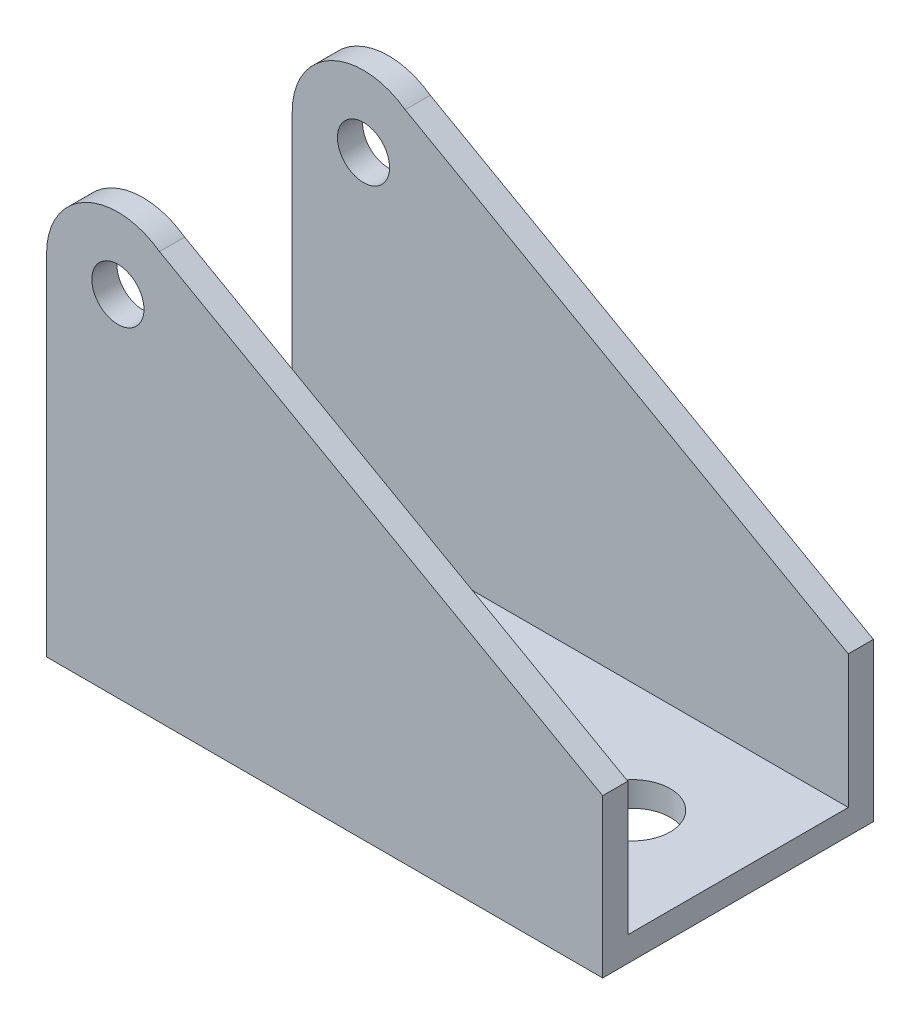
ISO-10303-21;
HEADER;
FILE_DESCRIPTION(('STEP AP214'),'2;1');
FILE_NAME('part.step','',(''),(''),'','','');
FILE_SCHEMA(('AUTOMOTIVE_DESIGN { 1 0 10303 214 1 1 1 1 }'));
ENDSEC;
DATA;
#1=APPLICATION_CONTEXT('core data for automotive mechanical design processes');
#2=APPLICATION_PROTOCOL_DEFINITION('international standard','automotive_design',2000,#1);
#3=PRODUCT_CONTEXT('',#1,'mechanical');
#4=PRODUCT('Part','Part','',(#3));
#5=PRODUCT_RELATED_PRODUCT_CATEGORY('part','',(#4));
#6=PRODUCT_DEFINITION_FORMATION('','',#4);
#7=PRODUCT_DEFINITION_CONTEXT('part definition',#1,'design');
#8=PRODUCT_DEFINITION('design','',#6,#7);
#9=PRODUCT_DEFINITION_SHAPE('','',#8);
#10=(LENGTH_UNIT() NAMED_UNIT(*) SI_UNIT(.MILLI.,.METRE.));
#11=(NAMED_UNIT(*) PLANE_ANGLE_UNIT() SI_UNIT($,.RADIAN.));
#12=(NAMED_UNIT(*) SI_UNIT($,.STERADIAN.) SOLID_ANGLE_UNIT());
#13=UNCERTAINTY_MEASURE_WITH_UNIT(LENGTH_MEASURE(1.E-05),#10,'distance_accuracy_value','');
#14=(GEOMETRIC_REPRESENTATION_CONTEXT(3) GLOBAL_UNCERTAINTY_ASSIGNED_CONTEXT((#13)) GLOBAL_UNIT_ASSIGNED_CONTEXT((#10,
#11,#12)) REPRESENTATION_CONTEXT('',''));
#15=CARTESIAN_POINT('',(0.,0.,0.));
#16=DIRECTION('',(0.,0.,1.));
#17=DIRECTION('',(1.,0.,0.));
#18=AXIS2_PLACEMENT_3D('',#15,#16,#17);
#19=CARTESIAN_POINT('',(-34.5093541589494,0.,28.26));
#20=DIRECTION('',(1.,0.,0.));
#21=DIRECTION('',(0.,0.,-1.));
#22=AXIS2_PLACEMENT_3D('',#19,#20,#21);
#23=PLANE('',#22);
#24=DIRECTION('',(0.,1.,0.));
#25=VECTOR('',#24,1.);
#26=CARTESIAN_POINT('',(-34.5093541589494,-45.70762571926,18.22));
#27=LINE('',#26,#25);
#28=CARTESIAN_POINT('',(-34.5093541589494,-38.3049212208948,18.22));
#29=VERTEX_POINT('',#28);
#30=CARTESIAN_POINT('',(-34.5093541589494,-35.70762571926,18.22));
#31=VERTEX_POINT('',#30);
#32=EDGE_CURVE('E169',#29,#31,#27,.T.);
#33=ORIENTED_EDGE('',*,*,#32,.F.);
#34=DIRECTION('',(0.,0.,-1.));
#35=VECTOR('',#34,1.);
#36=CARTESIAN_POINT('',(-34.5093541589494,-38.3049212208948,28.26));
#37=LINE('',#36,#35);
#38=CARTESIAN_POINT('',(-34.5093541589494,-38.3049212208948,28.26));
#39=VERTEX_POINT('',#38);
#40=EDGE_CURVE('E253',#39,#29,#37,.T.);
#41=ORIENTED_EDGE('',*,*,#40,.F.);
#42=DIRECTION('',(0.,-1.,0.));
#43=VECTOR('',#42,1.);
#44=CARTESIAN_POINT('',(-34.5093541589494,0.,28.26));
#45=LINE('',#44,#43);
#46=CARTESIAN_POINT('',(-34.5093541589494,-1.80492122089481,28.26));
#47=VERTEX_POINT('',#46);
#48=EDGE_CURVE('E213',#47,#39,#45,.T.);
#49=ORIENTED_EDGE('',*,*,#48,.F.);
#50=DIRECTION('',(0.,0.,-1.));
#51=VECTOR('',#50,1.);
#52=CARTESIAN_POINT('',(-34.5093541589494,-1.80492122089481,28.26));
#53=LINE('',#52,#51);
#54=CARTESIAN_POINT('',(-34.5093541589494,-1.80492122089481,25.64));
#55=VERTEX_POINT('',#54);
#56=EDGE_CURVE('E50',#47,#55,#53,.T.);
#57=ORIENTED_EDGE('',*,*,#56,.T.);
#58=DIRECTION('',(0.,1.,0.));
#59=VECTOR('',#58,1.);
#60=CARTESIAN_POINT('',(-34.5093541589494,0.,25.64));
#61=LINE('',#60,#59);
#62=CARTESIAN_POINT('',(-34.5093541589494,-35.70762571926,25.64));
#63=VERTEX_POINT('',#62);
#64=EDGE_CURVE('E193',#63,#55,#61,.T.);
#65=ORIENTED_EDGE('',*,*,#64,.F.);
#66=DIRECTION('',(0.,0.,-1.));
#67=VECTOR('',#66,1.);
#68=CARTESIAN_POINT('',(-34.5093541589494,-35.70762571926,28.26));
#69=LINE('',#68,#67);
#70=EDGE_CURVE('E206',#63,#31,#69,.T.);
#71=ORIENTED_EDGE('',*,*,#70,.T.);
#72=EDGE_LOOP('',(#33,#41,#49,#57,#65,#71));
#73=FACE_BOUND('',#72,.T.);
#74=ADVANCED_FACE('F42',(#73),#23,.F.);
#75=CARTESIAN_POINT('',(0.,-38.3049212208948,28.26));
#76=DIRECTION('',(0.,1.,0.));
#77=DIRECTION('',(-1.,0.,0.));
#78=AXIS2_PLACEMENT_3D('',#75,#76,#77);
#79=PLANE('',#78);
#80=CARTESIAN_POINT('',(12.5306458410506,-38.3049212208948,14.13));
#81=DIRECTION('',(0.,1.,0.));
#82=DIRECTION('',(-1.,0.,0.));
#83=AXIS2_PLACEMENT_3D('',#80,#81,#82);
#84=CIRCLE('',#83,3.92);
#85=CARTESIAN_POINT('',(8.61064584105055,-38.3049212208948,14.13));
#86=VERTEX_POINT('',#85);
#87=EDGE_CURVE('E178',#86,#86,#84,.T.);
#88=ORIENTED_EDGE('',*,*,#87,.T.);
#89=EDGE_LOOP('',(#88));
#90=FACE_BOUND('',#89,.T.);
#91=DIRECTION('',(-1.,0.,0.));
#92=VECTOR('',#91,1.);
#93=CARTESIAN_POINT('',(0.,-38.3049212208948,18.22));
#94=LINE('',#93,#92);
#95=CARTESIAN_POINT('',(-26.3193541589494,-38.3049212208948,18.22));
#96=VERTEX_POINT('',#95);
#97=EDGE_CURVE('E176',#96,#29,#94,.T.);
#98=ORIENTED_EDGE('',*,*,#97,.F.);
#99=CARTESIAN_POINT('',(-26.3193541589494,-38.3049212208948,14.13));
#100=DIRECTION('',(0.,1.,0.));
#101=DIRECTION('',(-1.,0.,0.));
#102=AXIS2_PLACEMENT_3D('',#99,#100,#101);
#103=CIRCLE('',#102,4.09);
#104=CARTESIAN_POINT('',(-26.3193541589494,-38.3049212208948,10.04));
#105=VERTEX_POINT('',#104);
#106=EDGE_CURVE('E173',#96,#105,#103,.T.);
#107=ORIENTED_EDGE('',*,*,#106,.T.);
#108=DIRECTION('',(-1.,0.,0.));
#109=VECTOR('',#108,1.);
#110=CARTESIAN_POINT('',(0.,-38.3049212208948,10.04));
#111=LINE('',#110,#109);
#112=CARTESIAN_POINT('',(-34.5093541589494,-38.3049212208948,10.04));
#113=VERTEX_POINT('',#112);
#114=EDGE_CURVE('E150',#105,#113,#111,.T.);
#115=ORIENTED_EDGE('',*,*,#114,.T.);
#116=CARTESIAN_POINT('',(-34.5093541589494,-38.3049212208948,0.));
#117=VERTEX_POINT('',#116);
#118=EDGE_CURVE('E252',#113,#117,#37,.T.);
#119=ORIENTED_EDGE('',*,*,#118,.T.);
#120=DIRECTION('',(1.,0.,0.));
#121=VECTOR('',#120,1.);
#122=CARTESIAN_POINT('',(0.,-38.3049212208948,0.));
#123=LINE('',#122,#121);
#124=CARTESIAN_POINT('',(23.5306458410505,-38.3049212208948,0.));
#125=VERTEX_POINT('',#124);
#126=EDGE_CURVE('E232',#117,#125,#123,.T.);
#127=ORIENTED_EDGE('',*,*,#126,.T.);
#128=DIRECTION('',(0.,0.,-1.));
#129=VECTOR('',#128,1.);
#130=CARTESIAN_POINT('',(23.5306458410505,-38.3049212208948,28.26));
#131=LINE('',#130,#129);
#132=CARTESIAN_POINT('',(23.5306458410505,-38.3049212208948,28.26));
#133=VERTEX_POINT('',#132);
#134=EDGE_CURVE('E249',#133,#125,#131,.T.);
#135=ORIENTED_EDGE('',*,*,#134,.F.);
#136=DIRECTION('',(1.,0.,0.));
#137=VECTOR('',#136,1.);
#138=CARTESIAN_POINT('',(0.,-38.3049212208948,28.26));
#139=LINE('',#138,#137);
#140=EDGE_CURVE('E216',#39,#133,#139,.T.);
#141=ORIENTED_EDGE('',*,*,#140,.F.);
#142=ORIENTED_EDGE('',*,*,#40,.T.);
#143=EDGE_LOOP('',(#98,#107,#115,#119,#127,#135,#141,#142));
#144=FACE_BOUND('',#143,.T.);
#145=ADVANCED_FACE('F288',(#90,#144),#79,.F.);
#146=CARTESIAN_POINT('',(-37.6969046169145,-35.70762571926,2.62));
#147=DIRECTION('',(0.,-1.,0.));
#148=DIRECTION('',(0.,0.,-1.));
#149=AXIS2_PLACEMENT_3D('',#146,#147,#148);
#150=PLANE('',#149);
#151=CARTESIAN_POINT('',(12.5306458410506,-35.70762571926,14.13));
#152=DIRECTION('',(0.,1.,0.));
#153=DIRECTION('',(0.,0.,1.));
#154=AXIS2_PLACEMENT_3D('',#151,#152,#153);
#155=CIRCLE('',#154,3.92);
#156=CARTESIAN_POINT('',(12.5306458410506,-35.70762571926,18.05));
#157=VERTEX_POINT('',#156);
#158=EDGE_CURVE('E171',#157,#157,#155,.T.);
#159=ORIENTED_EDGE('',*,*,#158,.F.);
#160=EDGE_LOOP('',(#159));
#161=FACE_BOUND('',#160,.T.);
#162=DIRECTION('',(-1.,0.,0.));
#163=VECTOR('',#162,1.);
#164=CARTESIAN_POINT('',(0.,-35.70762571926,18.22));
#165=LINE('',#164,#163);
#166=CARTESIAN_POINT('',(-26.3193541589494,-35.70762571926,18.22));
#167=VERTEX_POINT('',#166);
#168=EDGE_CURVE('E57',#167,#31,#165,.T.);
#169=ORIENTED_EDGE('',*,*,#168,.T.);
#170=ORIENTED_EDGE('',*,*,#70,.F.);
#171=DIRECTION('',(1.,0.,0.));
#172=VECTOR('',#171,1.);
#173=CARTESIAN_POINT('',(-37.6969046169145,-35.70762571926,25.64));
#174=LINE('',#173,#172);
#175=CARTESIAN_POINT('',(23.5306458410505,-35.70762571926,25.64));
#176=VERTEX_POINT('',#175);
#177=EDGE_CURVE('E181',#63,#176,#174,.T.);
#178=ORIENTED_EDGE('',*,*,#177,.T.);
#179=DIRECTION('',(0.,0.,1.));
#180=VECTOR('',#179,1.);
#181=CARTESIAN_POINT('',(23.5306458410505,-35.70762571926,28.26));
#182=LINE('',#181,#180);
#183=CARTESIAN_POINT('',(23.5306458410505,-35.70762571926,2.62));
#184=VERTEX_POINT('',#183);
#185=EDGE_CURVE('E11',#184,#176,#182,.T.);
#186=ORIENTED_EDGE('',*,*,#185,.F.);
#187=DIRECTION('',(1.,0.,0.));
#188=VECTOR('',#187,1.);
#189=CARTESIAN_POINT('',(-37.6969046169145,-35.70762571926,2.62));
#190=LINE('',#189,#188);
#191=CARTESIAN_POINT('',(-34.5093541589494,-35.70762571926,2.62));
#192=VERTEX_POINT('',#191);
#193=EDGE_CURVE('E182',#192,#184,#190,.T.);
#194=ORIENTED_EDGE('',*,*,#193,.F.);
#195=CARTESIAN_POINT('',(-34.5093541589494,-35.70762571926,10.04));
#196=VERTEX_POINT('',#195);
#197=EDGE_CURVE('E164',#196,#192,#69,.T.);
#198=ORIENTED_EDGE('',*,*,#197,.F.);
#199=DIRECTION('',(-1.,0.,0.));
#200=VECTOR('',#199,1.);
#201=CARTESIAN_POINT('',(0.,-35.70762571926,10.04));
#202=LINE('',#201,#200);
#203=CARTESIAN_POINT('',(-26.3193541589494,-35.70762571926,10.04));
#204=VERTEX_POINT('',#203);
#205=EDGE_CURVE('E147',#204,#196,#202,.T.);
#206=ORIENTED_EDGE('',*,*,#205,.F.);
#207=CARTESIAN_POINT('',(-26.3193541589494,-35.70762571926,14.13));
#208=DIRECTION('',(0.,1.,0.));
#209=DIRECTION('',(0.,0.,1.));
#210=AXIS2_PLACEMENT_3D('',#207,#208,#209);
#211=CIRCLE('',#210,4.09);
#212=EDGE_CURVE('E157',#167,#204,#211,.T.);
#213=ORIENTED_EDGE('',*,*,#212,.F.);
#214=EDGE_LOOP('',(#169,#170,#178,#186,#194,#198,#206,#213));
#215=FACE_BOUND('',#214,.T.);
#216=ADVANCED_FACE('F162',(#161,#215),#150,.F.);
#217=CARTESIAN_POINT('',(-27.0693541589495,-1.80492122089481,28.26));
#218=DIRECTION('',(0.,0.,-1.));
#219=DIRECTION('',(-1.,0.,0.));
#220=AXIS2_PLACEMENT_3D('',#217,#218,#219);
#221=CYLINDRICAL_SURFACE('',#220,7.44);
#222=DIRECTION('',(0.,0.,-1.));
#223=VECTOR('',#222,1.);
#224=CARTESIAN_POINT('',(-22.7212341548596,4.23225133171899,28.26));
#225=LINE('',#224,#223);
#226=CARTESIAN_POINT('',(-22.7212341548596,4.23225133171899,28.26));
#227=VERTEX_POINT('',#226);
#228=CARTESIAN_POINT('',(-22.7212341548596,4.23225133171899,25.64));
#229=VERTEX_POINT('',#228);
#230=EDGE_CURVE('E242',#227,#229,#225,.T.);
#231=ORIENTED_EDGE('',*,*,#230,.T.);
#232=CARTESIAN_POINT('',(-27.0693541589495,-1.80492122089481,25.64));
#233=DIRECTION('',(0.,0.,-1.));
#234=DIRECTION('',(-1.,0.,0.));
#235=AXIS2_PLACEMENT_3D('',#232,#233,#234);
#236=CIRCLE('',#235,7.44);
#237=EDGE_CURVE('E65',#229,#55,#236,.F.);
#238=ORIENTED_EDGE('',*,*,#237,.T.);
#239=ORIENTED_EDGE('',*,*,#56,.F.);
#240=CARTESIAN_POINT('',(-27.0693541589495,-1.80492122089481,28.26));
#241=DIRECTION('',(0.,0.,1.));
#242=DIRECTION('',(1.,0.,0.));
#243=AXIS2_PLACEMENT_3D('',#240,#241,#242);
#244=CIRCLE('',#243,7.44);
#245=EDGE_CURVE('E210',#47,#227,#244,.F.);
#246=ORIENTED_EDGE('',*,*,#245,.T.);
#247=EDGE_LOOP('',(#231,#238,#239,#246));
#248=FACE_BOUND('',#247,.T.);
#249=ADVANCED_FACE('F307',(#248),#221,.T.);
#250=CARTESIAN_POINT('',(-3.66420099118264,-6.50401282728867,28.26));
#251=DIRECTION('',(0.490840522048077,0.871249437254092,0.));
#252=DIRECTION('',(-0.871249437254092,0.490840522048077,0.));
#253=AXIS2_PLACEMENT_3D('',#250,#251,#252);
#254=PLANE('',#253);
#255=DIRECTION('',(0.,0.,-1.));
#256=VECTOR('',#255,1.);
#257=CARTESIAN_POINT('',(23.5306458410505,-21.8249212208948,28.26));
#258=LINE('',#257,#256);
#259=CARTESIAN_POINT('',(23.5306458410505,-21.8249212208948,28.26));
#260=VERTEX_POINT('',#259);
#261=CARTESIAN_POINT('',(23.5306458410505,-21.8249212208948,25.64));
#262=VERTEX_POINT('',#261);
#263=EDGE_CURVE('E246',#260,#262,#258,.T.);
#264=ORIENTED_EDGE('',*,*,#263,.T.);
#265=DIRECTION('',(-0.871249437254092,0.490840522048077,0.));
#266=VECTOR('',#265,1.);
#267=CARTESIAN_POINT('',(-3.66420099118264,-6.50401282728867,25.64));
#268=LINE('',#267,#266);
#269=EDGE_CURVE('E188',#262,#229,#268,.T.);
#270=ORIENTED_EDGE('',*,*,#269,.T.);
#271=ORIENTED_EDGE('',*,*,#230,.F.);
#272=DIRECTION('',(0.871249437254092,-0.490840522048077,0.));
#273=VECTOR('',#272,1.);
#274=CARTESIAN_POINT('',(-3.66420099118264,-6.50401282728867,28.26));
#275=LINE('',#274,#273);
#276=EDGE_CURVE('E220',#227,#260,#275,.T.);
#277=ORIENTED_EDGE('',*,*,#276,.T.);
#278=EDGE_LOOP('',(#264,#270,#271,#277));
#279=FACE_BOUND('',#278,.T.);
#280=ADVANCED_FACE('F326',(#279),#254,.T.);
#281=CARTESIAN_POINT('',(-27.0693541589495,-1.80492122089481,28.26));
#282=DIRECTION('',(0.,0.,-1.));
#283=DIRECTION('',(-1.,0.,0.));
#284=AXIS2_PLACEMENT_3D('',#281,#282,#283);
#285=CYLINDRICAL_SURFACE('',#284,2.72);
#286=CARTESIAN_POINT('',(-27.0693541589495,-1.80492122089481,28.26));
#287=DIRECTION('',(0.,0.,1.));
#288=DIRECTION('',(1.,0.,0.));
#289=AXIS2_PLACEMENT_3D('',#286,#287,#288);
#290=CIRCLE('',#289,2.72);
#291=CARTESIAN_POINT('',(-24.3493541589495,-1.80492122089481,28.26));
#292=VERTEX_POINT('',#291);
#293=EDGE_CURVE('E223',#292,#292,#290,.T.);
#294=ORIENTED_EDGE('',*,*,#293,.T.);
#295=EDGE_LOOP('',(#294));
#296=FACE_BOUND('',#295,.T.);
#297=CARTESIAN_POINT('',(-27.0693541589495,-1.80492122089481,25.64));
#298=DIRECTION('',(0.,0.,-1.));
#299=DIRECTION('',(-1.,0.,0.));
#300=AXIS2_PLACEMENT_3D('',#297,#298,#299);
#301=CIRCLE('',#300,2.72);
#302=CARTESIAN_POINT('',(-29.7893541589495,-1.80492122089481,25.64));
#303=VERTEX_POINT('',#302);
#304=EDGE_CURVE('E185',#303,#303,#301,.T.);
#305=ORIENTED_EDGE('',*,*,#304,.T.);
#306=EDGE_LOOP('',(#305));
#307=FACE_BOUND('',#306,.T.);
#308=ADVANCED_FACE('F272',(#296,#307),#285,.F.);
#309=CARTESIAN_POINT('',(-27.0693541589495,-1.80492122089481,2.62));
#310=DIRECTION('',(0.,0.,-1.));
#311=DIRECTION('',(-1.,0.,0.));
#312=AXIS2_PLACEMENT_3D('',#309,#310,#311);
#313=CIRCLE('',#312,7.44);
#314=CARTESIAN_POINT('',(-22.7212341548596,4.23225133171899,2.62));
#315=VERTEX_POINT('',#314);
#316=CARTESIAN_POINT('',(-34.5093541589494,-1.80492122089481,2.62));
#317=VERTEX_POINT('',#316);
#318=EDGE_CURVE('E201',#315,#317,#313,.F.);
#319=ORIENTED_EDGE('',*,*,#318,.F.);
#320=CARTESIAN_POINT('',(-22.7212341548596,4.23225133171899,0.));
#321=VERTEX_POINT('',#320);
#322=EDGE_CURVE('E226',#315,#321,#225,.T.);
#323=ORIENTED_EDGE('',*,*,#322,.T.);
#324=CARTESIAN_POINT('',(-27.0693541589495,-1.80492122089481,0.));
#325=DIRECTION('',(0.,0.,1.));
#326=DIRECTION('',(1.,0.,0.));
#327=AXIS2_PLACEMENT_3D('',#324,#325,#326);
#328=CIRCLE('',#327,7.44);
#329=CARTESIAN_POINT('',(-34.5093541589494,-1.80492122089481,0.));
#330=VERTEX_POINT('',#329);
#331=EDGE_CURVE('E209',#330,#321,#328,.F.);
#332=ORIENTED_EDGE('',*,*,#331,.F.);
#333=EDGE_CURVE('E256',#317,#330,#53,.T.);
#334=ORIENTED_EDGE('',*,*,#333,.F.);
#335=EDGE_LOOP('',(#319,#323,#332,#334));
#336=FACE_BOUND('',#335,.T.);
#337=ADVANCED_FACE('F44',(#336),#221,.T.);
#338=ORIENTED_EDGE('',*,*,#118,.F.);
#339=DIRECTION('',(0.,1.,0.));
#340=VECTOR('',#339,1.);
#341=CARTESIAN_POINT('',(-34.5093541589494,-45.70762571926,10.04));
#342=LINE('',#341,#340);
#343=EDGE_CURVE('E153',#113,#196,#342,.T.);
#344=ORIENTED_EDGE('',*,*,#343,.T.);
#345=ORIENTED_EDGE('',*,*,#197,.T.);
#346=DIRECTION('',(0.,1.,0.));
#347=VECTOR('',#346,1.);
#348=CARTESIAN_POINT('',(-34.5093541589494,0.,2.62));
#349=LINE('',#348,#347);
#350=EDGE_CURVE('E203',#192,#317,#349,.T.);
#351=ORIENTED_EDGE('',*,*,#350,.T.);
#352=ORIENTED_EDGE('',*,*,#333,.T.);
#353=DIRECTION('',(0.,-1.,0.));
#354=VECTOR('',#353,1.);
#355=CARTESIAN_POINT('',(-34.5093541589494,0.,0.));
#356=LINE('',#355,#354);
#357=EDGE_CURVE('E229',#330,#117,#356,.T.);
#358=ORIENTED_EDGE('',*,*,#357,.T.);
#359=EDGE_LOOP('',(#338,#344,#345,#351,#352,#358));
#360=FACE_BOUND('',#359,.T.);
#361=ADVANCED_FACE('F290',(#360),#23,.F.);
#362=CARTESIAN_POINT('',(23.5306458410505,0.,28.26));
#363=DIRECTION('',(-1.,0.,0.));
#364=DIRECTION('',(0.,0.,1.));
#365=AXIS2_PLACEMENT_3D('',#362,#363,#364);
#366=PLANE('',#365);
#367=CARTESIAN_POINT('',(23.5306458410505,-21.8249212208948,2.62));
#368=VERTEX_POINT('',#367);
#369=CARTESIAN_POINT('',(23.5306458410505,-21.8249212208948,0.));
#370=VERTEX_POINT('',#369);
#371=EDGE_CURVE('E245',#368,#370,#258,.T.);
#372=ORIENTED_EDGE('',*,*,#371,.F.);
#373=DIRECTION('',(0.,-1.,0.));
#374=VECTOR('',#373,1.);
#375=CARTESIAN_POINT('',(23.5306458410505,0.,2.62));
#376=LINE('',#375,#374);
#377=EDGE_CURVE('E198',#368,#184,#376,.T.);
#378=ORIENTED_EDGE('',*,*,#377,.T.);
#379=ORIENTED_EDGE('',*,*,#185,.T.);
#380=DIRECTION('',(0.,-1.,0.));
#381=VECTOR('',#380,1.);
#382=CARTESIAN_POINT('',(23.5306458410505,0.,25.64));
#383=LINE('',#382,#381);
#384=EDGE_CURVE('E190',#262,#176,#383,.T.);
#385=ORIENTED_EDGE('',*,*,#384,.F.);
#386=ORIENTED_EDGE('',*,*,#263,.F.);
#387=DIRECTION('',(0.,1.,0.));
#388=VECTOR('',#387,1.);
#389=CARTESIAN_POINT('',(23.5306458410505,0.,28.26));
#390=LINE('',#389,#388);
#391=EDGE_CURVE('E218',#133,#260,#390,.T.);
#392=ORIENTED_EDGE('',*,*,#391,.F.);
#393=ORIENTED_EDGE('',*,*,#134,.T.);
#394=DIRECTION('',(0.,1.,0.));
#395=VECTOR('',#394,1.);
#396=CARTESIAN_POINT('',(23.5306458410505,0.,0.));
#397=LINE('',#396,#395);
#398=EDGE_CURVE('E234',#125,#370,#397,.T.);
#399=ORIENTED_EDGE('',*,*,#398,.T.);
#400=EDGE_LOOP('',(#372,#378,#379,#385,#386,#392,#393,#399));
#401=FACE_BOUND('',#400,.T.);
#402=ADVANCED_FACE('F298',(#401),#366,.F.);
#403=DIRECTION('',(-0.871249437254092,0.490840522048077,0.));
#404=VECTOR('',#403,1.);
#405=CARTESIAN_POINT('',(-3.66420099118264,-6.50401282728867,2.62));
#406=LINE('',#405,#404);
#407=EDGE_CURVE('E196',#368,#315,#406,.T.);
#408=ORIENTED_EDGE('',*,*,#407,.F.);
#409=ORIENTED_EDGE('',*,*,#371,.T.);
#410=DIRECTION('',(0.871249437254092,-0.490840522048077,0.));
#411=VECTOR('',#410,1.);
#412=CARTESIAN_POINT('',(-3.66420099118264,-6.50401282728867,0.));
#413=LINE('',#412,#411);
#414=EDGE_CURVE('E237',#321,#370,#413,.T.);
#415=ORIENTED_EDGE('',*,*,#414,.F.);
#416=ORIENTED_EDGE('',*,*,#322,.F.);
#417=EDGE_LOOP('',(#408,#409,#415,#416));
#418=FACE_BOUND('',#417,.T.);
#419=ADVANCED_FACE('F270',(#418),#254,.T.);
#420=CARTESIAN_POINT('',(-27.0693541589495,-1.80492122089481,2.62));
#421=DIRECTION('',(0.,0.,-1.));
#422=DIRECTION('',(-1.,0.,0.));
#423=AXIS2_PLACEMENT_3D('',#420,#421,#422);
#424=CIRCLE('',#423,2.72);
#425=CARTESIAN_POINT('',(-29.7893541589495,-1.80492122089481,2.62));
#426=VERTEX_POINT('',#425);
#427=EDGE_CURVE('E195',#426,#426,#424,.T.);
#428=ORIENTED_EDGE('',*,*,#427,.F.);
#429=EDGE_LOOP('',(#428));
#430=FACE_BOUND('',#429,.T.);
#431=CARTESIAN_POINT('',(-27.0693541589495,-1.80492122089481,0.));
#432=DIRECTION('',(0.,0.,1.));
#433=DIRECTION('',(1.,0.,0.));
#434=AXIS2_PLACEMENT_3D('',#431,#432,#433);
#435=CIRCLE('',#434,2.72);
#436=CARTESIAN_POINT('',(-24.3493541589495,-1.80492122089481,0.));
#437=VERTEX_POINT('',#436);
#438=EDGE_CURVE('E214',#437,#437,#435,.T.);
#439=ORIENTED_EDGE('',*,*,#438,.F.);
#440=EDGE_LOOP('',(#439));
#441=FACE_BOUND('',#440,.T.);
#442=ADVANCED_FACE('F266',(#430,#441),#285,.F.);
#443=CARTESIAN_POINT('',(0.,0.,28.26));
#444=DIRECTION('',(0.,0.,1.));
#445=DIRECTION('',(1.,0.,0.));
#446=AXIS2_PLACEMENT_3D('',#443,#444,#445);
#447=PLANE('',#446);
#448=ORIENTED_EDGE('',*,*,#245,.F.);
#449=ORIENTED_EDGE('',*,*,#48,.T.);
#450=ORIENTED_EDGE('',*,*,#140,.T.);
#451=ORIENTED_EDGE('',*,*,#391,.T.);
#452=ORIENTED_EDGE('',*,*,#276,.F.);
#453=EDGE_LOOP('',(#448,#449,#450,#451,#452));
#454=FACE_BOUND('',#453,.T.);
#455=ORIENTED_EDGE('',*,*,#293,.F.);
#456=EDGE_LOOP('',(#455));
#457=FACE_BOUND('',#456,.T.);
#458=ADVANCED_FACE('F269',(#454,#457),#447,.T.);
#459=CARTESIAN_POINT('',(0.,0.,0.));
#460=DIRECTION('',(0.,0.,1.));
#461=DIRECTION('',(1.,0.,0.));
#462=AXIS2_PLACEMENT_3D('',#459,#460,#461);
#463=PLANE('',#462);
#464=ORIENTED_EDGE('',*,*,#331,.T.);
#465=ORIENTED_EDGE('',*,*,#414,.T.);
#466=ORIENTED_EDGE('',*,*,#398,.F.);
#467=ORIENTED_EDGE('',*,*,#126,.F.);
#468=ORIENTED_EDGE('',*,*,#357,.F.);
#469=EDGE_LOOP('',(#464,#465,#466,#467,#468));
#470=FACE_BOUND('',#469,.T.);
#471=ORIENTED_EDGE('',*,*,#438,.T.);
#472=EDGE_LOOP('',(#471));
#473=FACE_BOUND('',#472,.T.);
#474=ADVANCED_FACE('F275',(#470,#473),#463,.F.);
#475=CARTESIAN_POINT('',(-27.2114802716772,1.98287447938099,2.62));
#476=DIRECTION('',(0.,0.,-1.));
#477=DIRECTION('',(-1.,0.,0.));
#478=AXIS2_PLACEMENT_3D('',#475,#476,#477);
#479=PLANE('',#478);
#480=ORIENTED_EDGE('',*,*,#427,.T.);
#481=EDGE_LOOP('',(#480));
#482=FACE_BOUND('',#481,.T.);
#483=ORIENTED_EDGE('',*,*,#193,.T.);
#484=ORIENTED_EDGE('',*,*,#377,.F.);
#485=ORIENTED_EDGE('',*,*,#407,.T.);
#486=ORIENTED_EDGE('',*,*,#318,.T.);
#487=ORIENTED_EDGE('',*,*,#350,.F.);
#488=EDGE_LOOP('',(#483,#484,#485,#486,#487));
#489=FACE_BOUND('',#488,.T.);
#490=ADVANCED_FACE('F263',(#482,#489),#479,.F.);
#491=CARTESIAN_POINT('',(-27.2114802716772,1.98287447938099,25.64));
#492=DIRECTION('',(0.,0.,-1.));
#493=DIRECTION('',(-1.,0.,0.));
#494=AXIS2_PLACEMENT_3D('',#491,#492,#493);
#495=PLANE('',#494);
#496=ORIENTED_EDGE('',*,*,#304,.F.);
#497=EDGE_LOOP('',(#496));
#498=FACE_BOUND('',#497,.T.);
#499=ORIENTED_EDGE('',*,*,#64,.T.);
#500=ORIENTED_EDGE('',*,*,#237,.F.);
#501=ORIENTED_EDGE('',*,*,#269,.F.);
#502=ORIENTED_EDGE('',*,*,#384,.T.);
#503=ORIENTED_EDGE('',*,*,#177,.F.);
#504=EDGE_LOOP('',(#499,#500,#501,#502,#503));
#505=FACE_BOUND('',#504,.T.);
#506=ADVANCED_FACE('F283',(#498,#505),#495,.T.);
#507=CARTESIAN_POINT('',(0.,-45.70762571926,18.22));
#508=DIRECTION('',(0.,0.,-1.));
#509=DIRECTION('',(-1.,0.,0.));
#510=AXIS2_PLACEMENT_3D('',#507,#508,#509);
#511=PLANE('',#510);
#512=ORIENTED_EDGE('',*,*,#97,.T.);
#513=ORIENTED_EDGE('',*,*,#32,.T.);
#514=ORIENTED_EDGE('',*,*,#168,.F.);
#515=DIRECTION('',(0.,1.,0.));
#516=VECTOR('',#515,1.);
#517=CARTESIAN_POINT('',(-26.3193541589494,-45.70762571926,18.22));
#518=LINE('',#517,#516);
#519=EDGE_CURVE('E154',#96,#167,#518,.T.);
#520=ORIENTED_EDGE('',*,*,#519,.F.);
#521=EDGE_LOOP('',(#512,#513,#514,#520));
#522=FACE_BOUND('',#521,.T.);
#523=ADVANCED_FACE('F314',(#522),#511,.T.);
#524=CARTESIAN_POINT('',(0.,-45.70762571926,10.04));
#525=DIRECTION('',(0.,0.,-1.));
#526=DIRECTION('',(-1.,0.,0.));
#527=AXIS2_PLACEMENT_3D('',#524,#525,#526);
#528=PLANE('',#527);
#529=DIRECTION('',(0.,1.,0.));
#530=VECTOR('',#529,1.);
#531=CARTESIAN_POINT('',(-26.3193541589494,-45.70762571926,10.04));
#532=LINE('',#531,#530);
#533=EDGE_CURVE('E143',#105,#204,#532,.T.);
#534=ORIENTED_EDGE('',*,*,#533,.T.);
#535=ORIENTED_EDGE('',*,*,#205,.T.);
#536=ORIENTED_EDGE('',*,*,#343,.F.);
#537=ORIENTED_EDGE('',*,*,#114,.F.);
#538=EDGE_LOOP('',(#534,#535,#536,#537));
#539=FACE_BOUND('',#538,.T.);
#540=ADVANCED_FACE('F145',(#539),#528,.F.);
#541=CARTESIAN_POINT('',(-26.3193541589494,-45.70762571926,14.13));
#542=DIRECTION('',(0.,1.,0.));
#543=DIRECTION('',(0.,0.,1.));
#544=AXIS2_PLACEMENT_3D('',#541,#542,#543);
#545=CYLINDRICAL_SURFACE('',#544,4.09);
#546=ORIENTED_EDGE('',*,*,#519,.T.);
#547=ORIENTED_EDGE('',*,*,#212,.T.);
#548=ORIENTED_EDGE('',*,*,#533,.F.);
#549=ORIENTED_EDGE('',*,*,#106,.F.);
#550=EDGE_LOOP('',(#546,#547,#548,#549));
#551=FACE_BOUND('',#550,.T.);
#552=ADVANCED_FACE('F158',(#551),#545,.F.);
#553=CARTESIAN_POINT('',(12.5306458410506,-45.70762571926,14.13));
#554=DIRECTION('',(0.,1.,0.));
#555=DIRECTION('',(0.,0.,1.));
#556=AXIS2_PLACEMENT_3D('',#553,#554,#555);
#557=CYLINDRICAL_SURFACE('',#556,3.92);
#558=ORIENTED_EDGE('',*,*,#158,.T.);
#559=EDGE_LOOP('',(#558));
#560=FACE_BOUND('',#559,.T.);
#561=ORIENTED_EDGE('',*,*,#87,.F.);
#562=EDGE_LOOP('',(#561));
#563=FACE_BOUND('',#562,.T.);
#564=ADVANCED_FACE('F365',(#560,#563),#557,.F.);
#565=CLOSED_SHELL('',(#74,#145,#216,#249,#280,#308,#337,#361,#402,#419,#442,#458,#474,#490,#506,
#523,#540,#552,#564));
#566=MANIFOLD_SOLID_BREP('B2',#565);
#567=ADVANCED_BREP_SHAPE_REPRESENTATION('',(#18,#566),#14);
#568=SHAPE_DEFINITION_REPRESENTATION(#9,#567);
ENDSEC;
END-ISO-10303-21;
